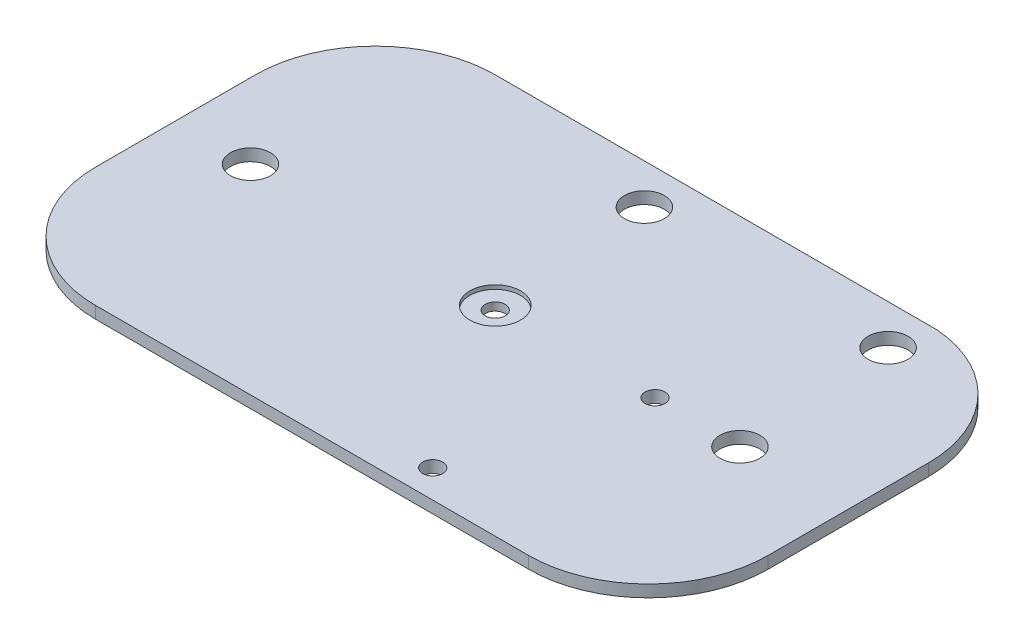
ISO-10303-21;
HEADER;
FILE_DESCRIPTION(('STEP AP214'),'2;1');
FILE_NAME('part.step','',(''),(''),'','','');
FILE_SCHEMA(('AUTOMOTIVE_DESIGN { 1 0 10303 214 1 1 1 1 }'));
ENDSEC;
DATA;
#1=APPLICATION_CONTEXT('core data for automotive mechanical design processes');
#2=APPLICATION_PROTOCOL_DEFINITION('international standard','automotive_design',2000,#1);
#3=PRODUCT_CONTEXT('',#1,'mechanical');
#4=PRODUCT('Part','Part','',(#3));
#5=PRODUCT_RELATED_PRODUCT_CATEGORY('part','',(#4));
#6=PRODUCT_DEFINITION_FORMATION('','',#4);
#7=PRODUCT_DEFINITION_CONTEXT('part definition',#1,'design');
#8=PRODUCT_DEFINITION('design','',#6,#7);
#9=PRODUCT_DEFINITION_SHAPE('','',#8);
#10=(LENGTH_UNIT() NAMED_UNIT(*) SI_UNIT(.MILLI.,.METRE.));
#11=(NAMED_UNIT(*) PLANE_ANGLE_UNIT() SI_UNIT($,.RADIAN.));
#12=(NAMED_UNIT(*) SI_UNIT($,.STERADIAN.) SOLID_ANGLE_UNIT());
#13=UNCERTAINTY_MEASURE_WITH_UNIT(LENGTH_MEASURE(1.E-05),#10,'distance_accuracy_value','');
#14=(GEOMETRIC_REPRESENTATION_CONTEXT(3) GLOBAL_UNCERTAINTY_ASSIGNED_CONTEXT((#13)) GLOBAL_UNIT_ASSIGNED_CONTEXT((#10,
#11,#12)) REPRESENTATION_CONTEXT('',''));
#15=CARTESIAN_POINT('',(0.,0.,0.));
#16=DIRECTION('',(0.,0.,1.));
#17=DIRECTION('',(1.,0.,0.));
#18=AXIS2_PLACEMENT_3D('',#15,#16,#17);
#19=CARTESIAN_POINT('',(30.,-50.,50.));
#20=DIRECTION('',(0.,1.,0.));
#21=DIRECTION('',(0.,0.,1.));
#22=AXIS2_PLACEMENT_3D('',#19,#20,#21);
#23=CYLINDRICAL_SURFACE('',#22,2.5);
#24=CARTESIAN_POINT('',(30.,0.,50.));
#25=DIRECTION('',(0.,-1.,0.));
#26=DIRECTION('',(0.,0.,-1.));
#27=AXIS2_PLACEMENT_3D('',#24,#25,#26);
#28=CIRCLE('',#27,2.5);
#29=CARTESIAN_POINT('',(30.,0.,52.5));
#30=VERTEX_POINT('',#29);
#31=EDGE_CURVE('E152',#30,#30,#28,.T.);
#32=CARTESIAN_POINT('',(30.,1.99999999999999,50.));
#33=DIRECTION('',(0.,1.,0.));
#34=DIRECTION('',(-1.,0.,0.));
#35=AXIS2_PLACEMENT_3D('',#32,#33,#34);
#36=CIRCLE('',#35,2.5);
#37=CARTESIAN_POINT('',(30.,1.99999999999999,52.5));
#38=VERTEX_POINT('',#37);
#39=EDGE_CURVE('E153',#38,#38,#36,.F.);
#40=CARTESIAN_POINT('',(30.,0.,52.5));
#41=CARTESIAN_POINT('',(30.,0.0208333333333333,52.5));
#42=CARTESIAN_POINT('',(30.,0.0416666666666667,52.5));
#43=CARTESIAN_POINT('',(30.,0.0833333333333334,52.5));
#44=CARTESIAN_POINT('',(30.,0.104166666666667,52.5));
#45=CARTESIAN_POINT('',(30.,0.145833333333333,52.5));
#46=CARTESIAN_POINT('',(30.,0.166666666666667,52.5));
#47=CARTESIAN_POINT('',(30.,0.208333333333334,52.5));
#48=CARTESIAN_POINT('',(30.,0.229166666666667,52.5));
#49=CARTESIAN_POINT('',(30.,0.270833333333334,52.5));
#50=CARTESIAN_POINT('',(30.,0.291666666666667,52.5));
#51=CARTESIAN_POINT('',(30.,0.333333333333334,52.5));
#52=CARTESIAN_POINT('',(30.,0.354166666666667,52.5));
#53=CARTESIAN_POINT('',(30.,0.395833333333334,52.5));
#54=CARTESIAN_POINT('',(30.,0.416666666666667,52.5));
#55=CARTESIAN_POINT('',(30.,0.458333333333334,52.5));
#56=CARTESIAN_POINT('',(30.,0.479166666666667,52.5));
#57=CARTESIAN_POINT('',(30.,0.520833333333331,52.5));
#58=CARTESIAN_POINT('',(30.,0.541666666666663,52.5));
#59=CARTESIAN_POINT('',(30.,0.583333333333327,52.5));
#60=CARTESIAN_POINT('',(30.,0.60416666666666,52.5));
#61=CARTESIAN_POINT('',(30.,0.645833333333327,52.5));
#62=CARTESIAN_POINT('',(30.,0.66666666666666,52.5));
#63=CARTESIAN_POINT('',(30.,0.708333333333327,52.5));
#64=CARTESIAN_POINT('',(30.,0.72916666666666,52.5));
#65=CARTESIAN_POINT('',(30.,0.770833333333327,52.5));
#66=CARTESIAN_POINT('',(30.,0.79166666666666,52.5));
#67=CARTESIAN_POINT('',(30.,0.833333333333327,52.5));
#68=CARTESIAN_POINT('',(30.,0.854166666666661,52.5));
#69=CARTESIAN_POINT('',(30.,0.895833333333327,52.5));
#70=CARTESIAN_POINT('',(30.,0.916666666666661,52.5));
#71=CARTESIAN_POINT('',(30.,0.958333333333327,52.5));
#72=CARTESIAN_POINT('',(30.,0.979166666666661,52.5));
#73=CARTESIAN_POINT('',(30.,1.02083333333333,52.5));
#74=CARTESIAN_POINT('',(30.,1.04166666666666,52.5));
#75=CARTESIAN_POINT('',(30.,1.08333333333333,52.5));
#76=CARTESIAN_POINT('',(30.,1.10416666666666,52.5));
#77=CARTESIAN_POINT('',(30.,1.14583333333333,52.5));
#78=CARTESIAN_POINT('',(30.,1.16666666666666,52.5));
#79=CARTESIAN_POINT('',(30.,1.20833333333333,52.5));
#80=CARTESIAN_POINT('',(30.,1.22916666666666,52.5));
#81=CARTESIAN_POINT('',(30.,1.27083333333333,52.5));
#82=CARTESIAN_POINT('',(30.,1.29166666666666,52.5));
#83=CARTESIAN_POINT('',(30.,1.33333333333333,52.5));
#84=CARTESIAN_POINT('',(30.,1.35416666666666,52.5));
#85=CARTESIAN_POINT('',(30.,1.39583333333333,52.5));
#86=CARTESIAN_POINT('',(30.,1.41666666666666,52.5));
#87=CARTESIAN_POINT('',(30.,1.45833333333333,52.5));
#88=CARTESIAN_POINT('',(30.,1.47916666666666,52.5));
#89=CARTESIAN_POINT('',(30.,1.52083333333332,52.5));
#90=CARTESIAN_POINT('',(30.,1.54166666666665,52.5));
#91=CARTESIAN_POINT('',(30.,1.58333333333332,52.5));
#92=CARTESIAN_POINT('',(30.,1.60416666666665,52.5));
#93=CARTESIAN_POINT('',(30.,1.64583333333332,52.5));
#94=CARTESIAN_POINT('',(30.,1.66666666666665,52.5));
#95=CARTESIAN_POINT('',(30.,1.70833333333332,52.5));
#96=CARTESIAN_POINT('',(30.,1.72916666666665,52.5));
#97=CARTESIAN_POINT('',(30.,1.77083333333332,52.5));
#98=CARTESIAN_POINT('',(30.,1.79166666666665,52.5));
#99=CARTESIAN_POINT('',(30.,1.83333333333332,52.5));
#100=CARTESIAN_POINT('',(30.,1.85416666666665,52.5));
#101=CARTESIAN_POINT('',(30.,1.89583333333332,52.5));
#102=CARTESIAN_POINT('',(30.,1.91666666666665,52.5));
#103=CARTESIAN_POINT('',(30.,1.95833333333332,52.5));
#104=CARTESIAN_POINT('',(30.,1.97916666666665,52.5));
#105=CARTESIAN_POINT('',(30.,1.99999999999999,52.5));
#106=B_SPLINE_CURVE_WITH_KNOTS('',3,(#40,#41,#42,#43,#44,#45,#46,#47,#48,#49,#50,#51,#52,#53,
#54,#55,#56,#57,#58,#59,#60,#61,#62,#63,#64,#65,#66,#67,#68,#69,#70,#71,#72,#73,#74,#75,#76,#77,
#78,#79,#80,#81,#82,#83,#84,#85,#86,#87,#88,#89,#90,#91,#92,#93,#94,#95,#96,#97,#98,#99,#100,
#101,#102,#103,#104,#105),.UNSPECIFIED.,.F.,.F.,(4,2,2,2,2,2,2,2,2,2,2,2,2,2,2,2,2,2,2,2,2,2,2,
2,2,2,2,2,2,2,2,2,4),(0.,0.0625000000000001,0.125,0.1875,0.25,0.3125,0.375,0.4375,0.5,
0.562499999999994,0.624999999999994,0.687499999999994,0.749999999999994,0.812499999999994,
0.874999999999994,0.937499999999994,0.999999999999994,1.06249999999999,1.12499999999999,
1.18749999999999,1.24999999999999,1.31249999999999,1.37499999999999,1.43749999999999,
1.49999999999999,1.56249999999999,1.62499999999999,1.68749999999999,1.74999999999999,
1.81249999999999,1.87499999999999,1.93749999999999,1.99999999999999),.UNSPECIFIED.);
#107=EDGE_CURVE('BSEAM42',#30,#38,#106,.T.);
#108=ORIENTED_EDGE('',*,*,#31,.T.);
#109=ORIENTED_EDGE('',*,*,#39,.F.);
#110=ORIENTED_EDGE('',*,*,#107,.T.);
#111=ORIENTED_EDGE('',*,*,#107,.F.);
#112=EDGE_LOOP('',(#108,#110,#109,#111));
#113=FACE_BOUND('',#112,.T.);
#114=ADVANCED_FACE('F42',(#113),#23,.F.);
#115=CARTESIAN_POINT('',(-50.,40.,0.));
#116=DIRECTION('',(0.,0.,-1.));
#117=DIRECTION('',(-1.,0.,0.));
#118=AXIS2_PLACEMENT_3D('',#115,#116,#117);
#119=PLANE('',#118);
#120=DIRECTION('',(1.,0.,0.));
#121=VECTOR('',#120,1.);
#122=CARTESIAN_POINT('',(-50.,0.,0.));
#123=LINE('',#122,#121);
#124=CARTESIAN_POINT('',(-20.,0.,0.));
#125=VERTEX_POINT('',#124);
#126=CARTESIAN_POINT('',(90.5,0.,0.));
#127=VERTEX_POINT('',#126);
#128=EDGE_CURVE('E114',#125,#127,#123,.T.);
#129=ORIENTED_EDGE('',*,*,#128,.F.);
#130=DIRECTION('',(0.,-1.,0.));
#131=VECTOR('',#130,1.);
#132=CARTESIAN_POINT('',(-20.,40.,0.));
#133=LINE('',#132,#131);
#134=CARTESIAN_POINT('',(-20.,2.99999999999998,0.));
#135=VERTEX_POINT('',#134);
#136=EDGE_CURVE('E11',#125,#135,#133,.F.);
#137=ORIENTED_EDGE('',*,*,#136,.T.);
#138=DIRECTION('',(1.,0.,0.));
#139=VECTOR('',#138,1.);
#140=CARTESIAN_POINT('',(150.,3.,0.));
#141=LINE('',#140,#139);
#142=CARTESIAN_POINT('',(90.5,2.99999999999999,0.));
#143=VERTEX_POINT('',#142);
#144=EDGE_CURVE('E116',#135,#143,#141,.T.);
#145=ORIENTED_EDGE('',*,*,#144,.T.);
#146=DIRECTION('',(0.,1.,0.));
#147=VECTOR('',#146,1.);
#148=CARTESIAN_POINT('',(90.5,-50.,0.));
#149=LINE('',#148,#147);
#150=EDGE_CURVE('E110',#127,#143,#149,.T.);
#151=ORIENTED_EDGE('',*,*,#150,.F.);
#152=EDGE_LOOP('',(#129,#137,#145,#151));
#153=FACE_BOUND('',#152,.T.);
#154=ADVANCED_FACE('F112',(#153),#119,.T.);
#155=CARTESIAN_POINT('',(150.,40.,100.));
#156=DIRECTION('',(0.,0.,1.));
#157=DIRECTION('',(1.,0.,0.));
#158=AXIS2_PLACEMENT_3D('',#155,#156,#157);
#159=PLANE('',#158);
#160=DIRECTION('',(-1.,0.,0.));
#161=VECTOR('',#160,1.);
#162=CARTESIAN_POINT('',(150.,0.,100.));
#163=LINE('',#162,#161);
#164=CARTESIAN_POINT('',(88.3346252635513,0.,100.));
#165=VERTEX_POINT('',#164);
#166=CARTESIAN_POINT('',(-20.,0.,100.));
#167=VERTEX_POINT('',#166);
#168=EDGE_CURVE('E144',#165,#167,#163,.T.);
#169=ORIENTED_EDGE('',*,*,#168,.F.);
#170=DIRECTION('',(0.,-1.,0.));
#171=VECTOR('',#170,1.);
#172=CARTESIAN_POINT('',(88.3346252635513,40.,100.));
#173=LINE('',#172,#171);
#174=CARTESIAN_POINT('',(88.3346252635513,2.99999999999999,100.));
#175=VERTEX_POINT('',#174);
#176=EDGE_CURVE('E58',#165,#175,#173,.F.);
#177=ORIENTED_EDGE('',*,*,#176,.T.);
#178=DIRECTION('',(1.,0.,0.));
#179=VECTOR('',#178,1.);
#180=CARTESIAN_POINT('',(150.,3.,100.));
#181=LINE('',#180,#179);
#182=CARTESIAN_POINT('',(-20.,2.99999999999998,100.));
#183=VERTEX_POINT('',#182);
#184=EDGE_CURVE('E189',#183,#175,#181,.T.);
#185=ORIENTED_EDGE('',*,*,#184,.F.);
#186=DIRECTION('',(0.,-1.,0.));
#187=VECTOR('',#186,1.);
#188=CARTESIAN_POINT('',(-20.,40.,100.));
#189=LINE('',#188,#187);
#190=EDGE_CURVE('E170',#183,#167,#189,.T.);
#191=ORIENTED_EDGE('',*,*,#190,.T.);
#192=EDGE_LOOP('',(#169,#177,#185,#191));
#193=FACE_BOUND('',#192,.T.);
#194=ADVANCED_FACE('F251',(#193),#159,.T.);
#195=CARTESIAN_POINT('',(30.,1.99999999999999,50.));
#196=DIRECTION('',(0.,1.,0.));
#197=DIRECTION('',(-1.,0.,0.));
#198=AXIS2_PLACEMENT_3D('',#195,#196,#197);
#199=PLANE('',#198);
#200=CARTESIAN_POINT('',(30.,1.99999999999999,50.));
#201=DIRECTION('',(0.,1.,0.));
#202=DIRECTION('',(-1.,0.,0.));
#203=AXIS2_PLACEMENT_3D('',#200,#201,#202);
#204=CIRCLE('',#203,6.35);
#205=CARTESIAN_POINT('',(23.65,1.99999999999999,50.));
#206=VERTEX_POINT('',#205);
#207=EDGE_CURVE('E155',#206,#206,#204,.T.);
#208=ORIENTED_EDGE('',*,*,#207,.T.);
#209=EDGE_LOOP('',(#208));
#210=FACE_BOUND('',#209,.T.);
#211=ORIENTED_EDGE('',*,*,#39,.T.);
#212=EDGE_LOOP('',(#211));
#213=FACE_BOUND('',#212,.T.);
#214=ADVANCED_FACE('F262',(#210,#213),#199,.T.);
#215=CARTESIAN_POINT('',(0.,0.,0.));
#216=DIRECTION('',(0.,-1.,0.));
#217=DIRECTION('',(0.,0.,-1.));
#218=AXIS2_PLACEMENT_3D('',#215,#216,#217);
#219=PLANE('',#218);
#220=CARTESIAN_POINT('',(57.3565923518305,0.,92.9999999999893));
#221=DIRECTION('',(0.,-1.,0.));
#222=DIRECTION('',(0.,0.,-1.));
#223=AXIS2_PLACEMENT_3D('',#220,#221,#222);
#224=CIRCLE('',#223,2.5);
#225=CARTESIAN_POINT('',(57.3565923518305,0.,90.4999999999893));
#226=VERTEX_POINT('',#225);
#227=EDGE_CURVE('E227',#226,#226,#224,.T.);
#228=ORIENTED_EDGE('',*,*,#227,.F.);
#229=EDGE_LOOP('',(#228));
#230=FACE_BOUND('',#229,.T.);
#231=DIRECTION('',(0.,0.,1.));
#232=VECTOR('',#231,1.);
#233=CARTESIAN_POINT('',(118.334625263551,0.,0.));
#234=LINE('',#233,#232);
#235=CARTESIAN_POINT('',(118.334625263551,0.,29.921750487743));
#236=VERTEX_POINT('',#235);
#237=CARTESIAN_POINT('',(118.334625263551,0.,70.));
#238=VERTEX_POINT('',#237);
#239=EDGE_CURVE('E206',#236,#238,#234,.T.);
#240=ORIENTED_EDGE('',*,*,#239,.T.);
#241=CARTESIAN_POINT('',(88.3346252635513,0.,70.));
#242=DIRECTION('',(0.,-1.,0.));
#243=DIRECTION('',(0.,0.,-1.));
#244=AXIS2_PLACEMENT_3D('',#241,#242,#243);
#245=CIRCLE('',#244,30.);
#246=EDGE_CURVE('E128',#238,#165,#245,.T.);
#247=ORIENTED_EDGE('',*,*,#246,.T.);
#248=ORIENTED_EDGE('',*,*,#168,.T.);
#249=CARTESIAN_POINT('',(-20.,0.,70.));
#250=DIRECTION('',(0.,-1.,0.));
#251=DIRECTION('',(0.,0.,-1.));
#252=AXIS2_PLACEMENT_3D('',#249,#250,#251);
#253=CIRCLE('',#252,30.);
#254=CARTESIAN_POINT('',(-50.,0.,70.));
#255=VERTEX_POINT('',#254);
#256=EDGE_CURVE('E138',#167,#255,#253,.T.);
#257=ORIENTED_EDGE('',*,*,#256,.T.);
#258=DIRECTION('',(0.,0.,-1.));
#259=VECTOR('',#258,1.);
#260=CARTESIAN_POINT('',(-50.,0.,100.));
#261=LINE('',#260,#259);
#262=CARTESIAN_POINT('',(-50.,0.,30.));
#263=VERTEX_POINT('',#262);
#264=EDGE_CURVE('E119',#255,#263,#261,.T.);
#265=ORIENTED_EDGE('',*,*,#264,.T.);
#266=CARTESIAN_POINT('',(-20.,0.,30.));
#267=DIRECTION('',(0.,-1.,0.));
#268=DIRECTION('',(0.,0.,-1.));
#269=AXIS2_PLACEMENT_3D('',#266,#267,#268);
#270=CIRCLE('',#269,30.);
#271=EDGE_CURVE('E133',#263,#125,#270,.T.);
#272=ORIENTED_EDGE('',*,*,#271,.T.);
#273=ORIENTED_EDGE('',*,*,#128,.T.);
#274=CARTESIAN_POINT('',(88.3346252635513,0.,29.921750487743));
#275=DIRECTION('',(0.,-1.,0.));
#276=DIRECTION('',(0.,0.,-1.));
#277=AXIS2_PLACEMENT_3D('',#274,#275,#276);
#278=CIRCLE('',#277,30.);
#279=EDGE_CURVE('E122',#127,#236,#278,.T.);
#280=ORIENTED_EDGE('',*,*,#279,.T.);
#281=EDGE_LOOP('',(#240,#247,#248,#257,#265,#272,#273,#280));
#282=FACE_BOUND('',#281,.T.);
#283=CARTESIAN_POINT('',(27.3346252635511,0.,10.));
#284=DIRECTION('',(0.,-1.,0.));
#285=DIRECTION('',(0.,0.,-1.));
#286=AXIS2_PLACEMENT_3D('',#283,#284,#285);
#287=CIRCLE('',#286,5.);
#288=CARTESIAN_POINT('',(27.3346252635511,0.,5.));
#289=VERTEX_POINT('',#288);
#290=EDGE_CURVE('E216',#289,#289,#287,.T.);
#291=ORIENTED_EDGE('',*,*,#290,.F.);
#292=EDGE_LOOP('',(#291));
#293=FACE_BOUND('',#292,.T.);
#294=CARTESIAN_POINT('',(88.3346252635511,0.,10.));
#295=DIRECTION('',(0.,-1.,0.));
#296=DIRECTION('',(0.,0.,-1.));
#297=AXIS2_PLACEMENT_3D('',#294,#295,#296);
#298=CIRCLE('',#297,5.);
#299=CARTESIAN_POINT('',(88.3346252635511,0.,5.));
#300=VERTEX_POINT('',#299);
#301=EDGE_CURVE('E222',#300,#300,#298,.T.);
#302=ORIENTED_EDGE('',*,*,#301,.F.);
#303=EDGE_LOOP('',(#302));
#304=FACE_BOUND('',#303,.T.);
#305=ORIENTED_EDGE('',*,*,#31,.F.);
#306=EDGE_LOOP('',(#305));
#307=FACE_BOUND('',#306,.T.);
#308=CARTESIAN_POINT('',(70.,0.,50.));
#309=DIRECTION('',(0.,-1.,0.));
#310=DIRECTION('',(0.,0.,-1.));
#311=AXIS2_PLACEMENT_3D('',#308,#309,#310);
#312=CIRCLE('',#311,2.5);
#313=CARTESIAN_POINT('',(70.,0.,52.5));
#314=VERTEX_POINT('',#313);
#315=EDGE_CURVE('E151',#314,#314,#312,.T.);
#316=ORIENTED_EDGE('',*,*,#315,.F.);
#317=EDGE_LOOP('',(#316));
#318=FACE_BOUND('',#317,.T.);
#319=CARTESIAN_POINT('',(91.25,0.,50.));
#320=DIRECTION('',(0.,-1.,0.));
#321=DIRECTION('',(0.,0.,-1.));
#322=AXIS2_PLACEMENT_3D('',#319,#320,#321);
#323=CIRCLE('',#322,5.00000000000001);
#324=CARTESIAN_POINT('',(91.25,0.,45.));
#325=VERTEX_POINT('',#324);
#326=EDGE_CURVE('E205',#325,#325,#323,.T.);
#327=ORIENTED_EDGE('',*,*,#326,.F.);
#328=EDGE_LOOP('',(#327));
#329=FACE_BOUND('',#328,.T.);
#330=CARTESIAN_POINT('',(-31.25,0.,50.));
#331=DIRECTION('',(0.,-1.,0.));
#332=DIRECTION('',(0.,0.,-1.));
#333=AXIS2_PLACEMENT_3D('',#330,#331,#332);
#334=CIRCLE('',#333,5.);
#335=CARTESIAN_POINT('',(-31.25,0.,45.));
#336=VERTEX_POINT('',#335);
#337=EDGE_CURVE('E209',#336,#336,#334,.T.);
#338=ORIENTED_EDGE('',*,*,#337,.F.);
#339=EDGE_LOOP('',(#338));
#340=FACE_BOUND('',#339,.T.);
#341=ADVANCED_FACE('F130',(#230,#282,#293,#304,#307,#318,#329,#340),#219,.T.);
#342=CARTESIAN_POINT('',(-20.,40.,70.));
#343=DIRECTION('',(0.,-1.,0.));
#344=DIRECTION('',(0.,0.,-1.));
#345=AXIS2_PLACEMENT_3D('',#342,#343,#344);
#346=CYLINDRICAL_SURFACE('',#345,30.);
#347=CARTESIAN_POINT('',(-20.,2.99999999999998,70.));
#348=DIRECTION('',(0.,-1.,0.));
#349=DIRECTION('',(1.,0.,0.));
#350=AXIS2_PLACEMENT_3D('',#347,#348,#349);
#351=CIRCLE('',#350,30.);
#352=CARTESIAN_POINT('',(-50.,2.99999999999998,70.));
#353=VERTEX_POINT('',#352);
#354=EDGE_CURVE('E65',#353,#183,#351,.F.);
#355=ORIENTED_EDGE('',*,*,#354,.F.);
#356=DIRECTION('',(0.,-1.,0.));
#357=VECTOR('',#356,1.);
#358=CARTESIAN_POINT('',(-50.,40.,70.));
#359=LINE('',#358,#357);
#360=EDGE_CURVE('E174',#255,#353,#359,.F.);
#361=ORIENTED_EDGE('',*,*,#360,.F.);
#362=ORIENTED_EDGE('',*,*,#256,.F.);
#363=ORIENTED_EDGE('',*,*,#190,.F.);
#364=EDGE_LOOP('',(#355,#361,#362,#363));
#365=FACE_BOUND('',#364,.T.);
#366=ADVANCED_FACE('F44',(#365),#346,.T.);
#367=CARTESIAN_POINT('',(-50.,40.,100.));
#368=DIRECTION('',(-1.,0.,0.));
#369=DIRECTION('',(0.,0.,1.));
#370=AXIS2_PLACEMENT_3D('',#367,#368,#369);
#371=PLANE('',#370);
#372=DIRECTION('',(0.,0.,1.));
#373=VECTOR('',#372,1.);
#374=CARTESIAN_POINT('',(-50.,2.99999999999998,0.));
#375=LINE('',#374,#373);
#376=CARTESIAN_POINT('',(-50.,2.99999999999998,30.));
#377=VERTEX_POINT('',#376);
#378=EDGE_CURVE('E142',#377,#353,#375,.T.);
#379=ORIENTED_EDGE('',*,*,#378,.F.);
#380=DIRECTION('',(0.,-1.,0.));
#381=VECTOR('',#380,1.);
#382=CARTESIAN_POINT('',(-50.,40.,30.));
#383=LINE('',#382,#381);
#384=EDGE_CURVE('E51',#377,#263,#383,.T.);
#385=ORIENTED_EDGE('',*,*,#384,.T.);
#386=ORIENTED_EDGE('',*,*,#264,.F.);
#387=ORIENTED_EDGE('',*,*,#360,.T.);
#388=EDGE_LOOP('',(#379,#385,#386,#387));
#389=FACE_BOUND('',#388,.T.);
#390=ADVANCED_FACE('F181',(#389),#371,.T.);
#391=CARTESIAN_POINT('',(-20.,40.,30.));
#392=DIRECTION('',(0.,-1.,0.));
#393=DIRECTION('',(0.,0.,-1.));
#394=AXIS2_PLACEMENT_3D('',#391,#392,#393);
#395=CYLINDRICAL_SURFACE('',#394,30.);
#396=CARTESIAN_POINT('',(-20.,2.99999999999998,30.));
#397=DIRECTION('',(0.,-1.,0.));
#398=DIRECTION('',(1.,0.,0.));
#399=AXIS2_PLACEMENT_3D('',#396,#397,#398);
#400=CIRCLE('',#399,30.);
#401=EDGE_CURVE('E164',#135,#377,#400,.F.);
#402=ORIENTED_EDGE('',*,*,#401,.F.);
#403=ORIENTED_EDGE('',*,*,#136,.F.);
#404=ORIENTED_EDGE('',*,*,#271,.F.);
#405=ORIENTED_EDGE('',*,*,#384,.F.);
#406=EDGE_LOOP('',(#402,#403,#404,#405));
#407=FACE_BOUND('',#406,.T.);
#408=ADVANCED_FACE('F185',(#407),#395,.T.);
#409=CARTESIAN_POINT('',(150.,3.,0.));
#410=DIRECTION('',(0.,-1.,0.));
#411=DIRECTION('',(1.,0.,0.));
#412=AXIS2_PLACEMENT_3D('',#409,#410,#411);
#413=PLANE('',#412);
#414=CARTESIAN_POINT('',(57.3565923518305,2.99999999999999,92.9999999999893));
#415=DIRECTION('',(0.,-1.,0.));
#416=DIRECTION('',(1.,0.,0.));
#417=AXIS2_PLACEMENT_3D('',#414,#415,#416);
#418=CIRCLE('',#417,2.5);
#419=CARTESIAN_POINT('',(59.8565923518305,2.99999999999999,92.9999999999893));
#420=VERTEX_POINT('',#419);
#421=EDGE_CURVE('E46',#420,#420,#418,.T.);
#422=ORIENTED_EDGE('',*,*,#421,.T.);
#423=EDGE_LOOP('',(#422));
#424=FACE_BOUND('',#423,.T.);
#425=ORIENTED_EDGE('',*,*,#401,.T.);
#426=ORIENTED_EDGE('',*,*,#378,.T.);
#427=ORIENTED_EDGE('',*,*,#354,.T.);
#428=ORIENTED_EDGE('',*,*,#184,.T.);
#429=CARTESIAN_POINT('',(88.3346252635513,2.99999999999999,70.));
#430=DIRECTION('',(0.,-1.,0.));
#431=DIRECTION('',(1.,0.,0.));
#432=AXIS2_PLACEMENT_3D('',#429,#430,#431);
#433=CIRCLE('',#432,30.);
#434=CARTESIAN_POINT('',(118.334625263551,3.,70.));
#435=VERTEX_POINT('',#434);
#436=EDGE_CURVE('E166',#175,#435,#433,.F.);
#437=ORIENTED_EDGE('',*,*,#436,.T.);
#438=DIRECTION('',(0.,0.,1.));
#439=VECTOR('',#438,1.);
#440=CARTESIAN_POINT('',(118.334625263551,3.,0.));
#441=LINE('',#440,#439);
#442=CARTESIAN_POINT('',(118.334625263551,3.,29.921750487743));
#443=VERTEX_POINT('',#442);
#444=EDGE_CURVE('E135',#443,#435,#441,.T.);
#445=ORIENTED_EDGE('',*,*,#444,.F.);
#446=CARTESIAN_POINT('',(88.3346252635513,3.,29.921750487743));
#447=DIRECTION('',(0.,-1.,0.));
#448=DIRECTION('',(1.,0.,0.));
#449=AXIS2_PLACEMENT_3D('',#446,#447,#448);
#450=CIRCLE('',#449,30.);
#451=EDGE_CURVE('E168',#443,#143,#450,.F.);
#452=ORIENTED_EDGE('',*,*,#451,.T.);
#453=ORIENTED_EDGE('',*,*,#144,.F.);
#454=EDGE_LOOP('',(#425,#426,#427,#428,#437,#445,#452,#453));
#455=FACE_BOUND('',#454,.T.);
#456=CARTESIAN_POINT('',(70.,2.99999999999999,50.));
#457=DIRECTION('',(0.,-1.,0.));
#458=DIRECTION('',(1.,0.,0.));
#459=AXIS2_PLACEMENT_3D('',#456,#457,#458);
#460=CIRCLE('',#459,2.5);
#461=CARTESIAN_POINT('',(70.,2.99999999999999,52.5));
#462=VERTEX_POINT('',#461);
#463=EDGE_CURVE('E148',#462,#462,#460,.T.);
#464=ORIENTED_EDGE('',*,*,#463,.T.);
#465=EDGE_LOOP('',(#464));
#466=FACE_BOUND('',#465,.T.);
#467=CARTESIAN_POINT('',(30.,2.99999999999999,50.));
#468=DIRECTION('',(0.,1.,0.));
#469=DIRECTION('',(-1.,0.,0.));
#470=AXIS2_PLACEMENT_3D('',#467,#468,#469);
#471=CIRCLE('',#470,6.35);
#472=CARTESIAN_POINT('',(23.65,2.99999999999999,50.));
#473=VERTEX_POINT('',#472);
#474=EDGE_CURVE('E196',#473,#473,#471,.T.);
#475=ORIENTED_EDGE('',*,*,#474,.F.);
#476=EDGE_LOOP('',(#475));
#477=FACE_BOUND('',#476,.T.);
#478=CARTESIAN_POINT('',(91.25,3.,50.));
#479=DIRECTION('',(0.,-1.,0.));
#480=DIRECTION('',(0.,0.,-1.));
#481=AXIS2_PLACEMENT_3D('',#478,#479,#480);
#482=CIRCLE('',#481,5.00000000000001);
#483=CARTESIAN_POINT('',(91.25,3.,45.));
#484=VERTEX_POINT('',#483);
#485=EDGE_CURVE('E202',#484,#484,#482,.T.);
#486=ORIENTED_EDGE('',*,*,#485,.T.);
#487=EDGE_LOOP('',(#486));
#488=FACE_BOUND('',#487,.T.);
#489=CARTESIAN_POINT('',(-31.25,3.,50.));
#490=DIRECTION('',(0.,-1.,0.));
#491=DIRECTION('',(0.,0.,-1.));
#492=AXIS2_PLACEMENT_3D('',#489,#490,#491);
#493=CIRCLE('',#492,5.);
#494=CARTESIAN_POINT('',(-31.25,3.,45.));
#495=VERTEX_POINT('',#494);
#496=EDGE_CURVE('E199',#495,#495,#493,.T.);
#497=ORIENTED_EDGE('',*,*,#496,.T.);
#498=EDGE_LOOP('',(#497));
#499=FACE_BOUND('',#498,.T.);
#500=CARTESIAN_POINT('',(27.3346252635511,3.,10.));
#501=DIRECTION('',(0.,-1.,0.));
#502=DIRECTION('',(0.,0.,-1.));
#503=AXIS2_PLACEMENT_3D('',#500,#501,#502);
#504=CIRCLE('',#503,5.);
#505=CARTESIAN_POINT('',(27.3346252635511,3.,5.));
#506=VERTEX_POINT('',#505);
#507=EDGE_CURVE('E215',#506,#506,#504,.T.);
#508=ORIENTED_EDGE('',*,*,#507,.T.);
#509=EDGE_LOOP('',(#508));
#510=FACE_BOUND('',#509,.T.);
#511=CARTESIAN_POINT('',(88.3346252635511,3.,10.));
#512=DIRECTION('',(0.,-1.,0.));
#513=DIRECTION('',(0.,0.,-1.));
#514=AXIS2_PLACEMENT_3D('',#511,#512,#513);
#515=CIRCLE('',#514,5.);
#516=CARTESIAN_POINT('',(88.3346252635511,3.,5.));
#517=VERTEX_POINT('',#516);
#518=EDGE_CURVE('E219',#517,#517,#515,.T.);
#519=ORIENTED_EDGE('',*,*,#518,.T.);
#520=EDGE_LOOP('',(#519));
#521=FACE_BOUND('',#520,.T.);
#522=ADVANCED_FACE('F186',(#424,#455,#466,#477,#488,#499,#510,#521),#413,.F.);
#523=CARTESIAN_POINT('',(88.3346252635513,40.,29.921750487743));
#524=DIRECTION('',(0.,1.,0.));
#525=DIRECTION('',(0.,0.,1.));
#526=AXIS2_PLACEMENT_3D('',#523,#524,#525);
#527=CYLINDRICAL_SURFACE('',#526,30.);
#528=ORIENTED_EDGE('',*,*,#451,.F.);
#529=DIRECTION('',(0.,-1.,0.));
#530=VECTOR('',#529,1.);
#531=CARTESIAN_POINT('',(118.334625263551,3.,29.921750487743));
#532=LINE('',#531,#530);
#533=EDGE_CURVE('E124',#236,#443,#532,.F.);
#534=ORIENTED_EDGE('',*,*,#533,.F.);
#535=ORIENTED_EDGE('',*,*,#279,.F.);
#536=ORIENTED_EDGE('',*,*,#150,.T.);
#537=EDGE_LOOP('',(#528,#534,#535,#536));
#538=FACE_BOUND('',#537,.T.);
#539=ADVANCED_FACE('F123',(#538),#527,.T.);
#540=CARTESIAN_POINT('',(118.334625263551,83.4152076037248,100.));
#541=DIRECTION('',(1.,0.,0.));
#542=DIRECTION('',(0.,1.,0.));
#543=AXIS2_PLACEMENT_3D('',#540,#541,#542);
#544=PLANE('',#543);
#545=ORIENTED_EDGE('',*,*,#239,.F.);
#546=ORIENTED_EDGE('',*,*,#533,.T.);
#547=ORIENTED_EDGE('',*,*,#444,.T.);
#548=DIRECTION('',(0.,-1.,0.));
#549=VECTOR('',#548,1.);
#550=CARTESIAN_POINT('',(118.334625263551,83.4152076037248,70.));
#551=LINE('',#550,#549);
#552=EDGE_CURVE('E127',#435,#238,#551,.T.);
#553=ORIENTED_EDGE('',*,*,#552,.T.);
#554=EDGE_LOOP('',(#545,#546,#547,#553));
#555=FACE_BOUND('',#554,.T.);
#556=ADVANCED_FACE('F270',(#555),#544,.T.);
#557=CARTESIAN_POINT('',(88.3346252635513,83.4152076037248,70.));
#558=DIRECTION('',(0.,-1.,0.));
#559=DIRECTION('',(1.,0.,0.));
#560=AXIS2_PLACEMENT_3D('',#557,#558,#559);
#561=CYLINDRICAL_SURFACE('',#560,30.);
#562=ORIENTED_EDGE('',*,*,#436,.F.);
#563=ORIENTED_EDGE('',*,*,#176,.F.);
#564=ORIENTED_EDGE('',*,*,#246,.F.);
#565=ORIENTED_EDGE('',*,*,#552,.F.);
#566=EDGE_LOOP('',(#562,#563,#564,#565));
#567=FACE_BOUND('',#566,.T.);
#568=ADVANCED_FACE('F271',(#567),#561,.T.);
#569=CARTESIAN_POINT('',(-31.25,3.,50.));
#570=DIRECTION('',(0.,-1.,0.));
#571=DIRECTION('',(0.,0.,-1.));
#572=AXIS2_PLACEMENT_3D('',#569,#570,#571);
#573=CYLINDRICAL_SURFACE('',#572,5.);
#574=ORIENTED_EDGE('',*,*,#496,.F.);
#575=EDGE_LOOP('',(#574));
#576=FACE_BOUND('',#575,.T.);
#577=ORIENTED_EDGE('',*,*,#337,.T.);
#578=EDGE_LOOP('',(#577));
#579=FACE_BOUND('',#578,.T.);
#580=ADVANCED_FACE('F273',(#576,#579),#573,.F.);
#581=CARTESIAN_POINT('',(91.25,3.,50.));
#582=DIRECTION('',(0.,-1.,0.));
#583=DIRECTION('',(0.,0.,-1.));
#584=AXIS2_PLACEMENT_3D('',#581,#582,#583);
#585=CYLINDRICAL_SURFACE('',#584,5.00000000000001);
#586=ORIENTED_EDGE('',*,*,#485,.F.);
#587=EDGE_LOOP('',(#586));
#588=FACE_BOUND('',#587,.T.);
#589=ORIENTED_EDGE('',*,*,#326,.T.);
#590=EDGE_LOOP('',(#589));
#591=FACE_BOUND('',#590,.T.);
#592=ADVANCED_FACE('F309',(#588,#591),#585,.F.);
#593=CARTESIAN_POINT('',(30.,1.99999999999999,50.));
#594=DIRECTION('',(0.,1.,0.));
#595=DIRECTION('',(-1.,0.,0.));
#596=AXIS2_PLACEMENT_3D('',#593,#594,#595);
#597=CYLINDRICAL_SURFACE('',#596,6.35);
#598=ORIENTED_EDGE('',*,*,#207,.F.);
#599=EDGE_LOOP('',(#598));
#600=FACE_BOUND('',#599,.T.);
#601=ORIENTED_EDGE('',*,*,#474,.T.);
#602=EDGE_LOOP('',(#601));
#603=FACE_BOUND('',#602,.T.);
#604=ADVANCED_FACE('F316',(#600,#603),#597,.F.);
#605=CARTESIAN_POINT('',(70.,-50.,50.));
#606=DIRECTION('',(0.,1.,0.));
#607=DIRECTION('',(0.,0.,1.));
#608=AXIS2_PLACEMENT_3D('',#605,#606,#607);
#609=CYLINDRICAL_SURFACE('',#608,2.5);
#610=CARTESIAN_POINT('',(70.,0.,52.5));
#611=CARTESIAN_POINT('',(70.,0.0312499999999989,52.5));
#612=CARTESIAN_POINT('',(70.,0.0624999999999978,52.5));
#613=CARTESIAN_POINT('',(70.,0.124999999999998,52.5));
#614=CARTESIAN_POINT('',(70.,0.156249999999999,52.5));
#615=CARTESIAN_POINT('',(70.,0.218749999999999,52.5));
#616=CARTESIAN_POINT('',(70.,0.249999999999998,52.5));
#617=CARTESIAN_POINT('',(70.,0.312499999999998,52.5));
#618=CARTESIAN_POINT('',(70.,0.343749999999999,52.5));
#619=CARTESIAN_POINT('',(70.,0.406249999999999,52.5));
#620=CARTESIAN_POINT('',(70.,0.437499999999998,52.5));
#621=CARTESIAN_POINT('',(70.,0.499999999999998,52.5));
#622=CARTESIAN_POINT('',(70.,0.531249999999999,52.5));
#623=CARTESIAN_POINT('',(70.,0.593749999999999,52.5));
#624=CARTESIAN_POINT('',(70.,0.624999999999998,52.5));
#625=CARTESIAN_POINT('',(70.,0.687499999999998,52.5));
#626=CARTESIAN_POINT('',(70.,0.718749999999999,52.5));
#627=CARTESIAN_POINT('',(70.,0.78125,52.5));
#628=CARTESIAN_POINT('',(70.,0.812499999999998,52.5));
#629=CARTESIAN_POINT('',(70.,0.874999999999996,52.5));
#630=CARTESIAN_POINT('',(70.,0.906249999999995,52.5));
#631=CARTESIAN_POINT('',(70.,0.968749999999995,52.5));
#632=CARTESIAN_POINT('',(70.,0.999999999999996,52.5));
#633=CARTESIAN_POINT('',(70.,1.0625,52.5));
#634=CARTESIAN_POINT('',(70.,1.09375,52.5));
#635=CARTESIAN_POINT('',(70.,1.15625,52.5));
#636=CARTESIAN_POINT('',(70.,1.1875,52.5));
#637=CARTESIAN_POINT('',(70.,1.25,52.5));
#638=CARTESIAN_POINT('',(70.,1.28125,52.5));
#639=CARTESIAN_POINT('',(70.,1.34375,52.5));
#640=CARTESIAN_POINT('',(70.,1.375,52.5));
#641=CARTESIAN_POINT('',(70.,1.4375,52.5));
#642=CARTESIAN_POINT('',(70.,1.46875,52.5));
#643=CARTESIAN_POINT('',(70.,1.53124999999999,52.5));
#644=CARTESIAN_POINT('',(70.,1.56249999999999,52.5));
#645=CARTESIAN_POINT('',(70.,1.62499999999999,52.5));
#646=CARTESIAN_POINT('',(70.,1.65624999999999,52.5));
#647=CARTESIAN_POINT('',(70.,1.71874999999999,52.5));
#648=CARTESIAN_POINT('',(70.,1.74999999999999,52.5));
#649=CARTESIAN_POINT('',(70.,1.81249999999999,52.5));
#650=CARTESIAN_POINT('',(70.,1.84374999999999,52.5));
#651=CARTESIAN_POINT('',(70.,1.90624999999999,52.5));
#652=CARTESIAN_POINT('',(70.,1.93749999999999,52.5));
#653=CARTESIAN_POINT('',(70.,1.99999999999999,52.5));
#654=CARTESIAN_POINT('',(70.,2.03124999999999,52.5));
#655=CARTESIAN_POINT('',(70.,2.09374999999999,52.5));
#656=CARTESIAN_POINT('',(70.,2.12499999999999,52.5));
#657=CARTESIAN_POINT('',(70.,2.18749999999999,52.5));
#658=CARTESIAN_POINT('',(70.,2.21874999999999,52.5));
#659=CARTESIAN_POINT('',(70.,2.28124999999999,52.5));
#660=CARTESIAN_POINT('',(70.,2.31249999999999,52.5));
#661=CARTESIAN_POINT('',(70.,2.37499999999999,52.5));
#662=CARTESIAN_POINT('',(70.,2.40624999999999,52.5));
#663=CARTESIAN_POINT('',(70.,2.46874999999999,52.5));
#664=CARTESIAN_POINT('',(70.,2.49999999999999,52.5));
#665=CARTESIAN_POINT('',(70.,2.56249999999999,52.5));
#666=CARTESIAN_POINT('',(70.,2.59374999999999,52.5));
#667=CARTESIAN_POINT('',(70.,2.65624999999999,52.5));
#668=CARTESIAN_POINT('',(70.,2.68749999999999,52.5));
#669=CARTESIAN_POINT('',(70.,2.74999999999999,52.5));
#670=CARTESIAN_POINT('',(70.,2.78124999999999,52.5));
#671=CARTESIAN_POINT('',(70.,2.84374999999999,52.5));
#672=CARTESIAN_POINT('',(70.,2.87499999999999,52.5));
#673=CARTESIAN_POINT('',(70.,2.93749999999999,52.5));
#674=CARTESIAN_POINT('',(70.,2.96874999999999,52.5));
#675=CARTESIAN_POINT('',(70.,2.99999999999999,52.5));
#676=B_SPLINE_CURVE_WITH_KNOTS('',3,(#610,#611,#612,#613,#614,#615,#616,#617,#618,#619,#620,
#621,#622,#623,#624,#625,#626,#627,#628,#629,#630,#631,#632,#633,#634,#635,#636,#637,#638,#639,
#640,#641,#642,#643,#644,#645,#646,#647,#648,#649,#650,#651,#652,#653,#654,#655,#656,#657,#658,
#659,#660,#661,#662,#663,#664,#665,#666,#667,#668,#669,#670,#671,#672,#673,#674,#675),
.UNSPECIFIED.,.F.,.F.,(4,2,2,2,2,2,2,2,2,2,2,2,2,2,2,2,2,2,2,2,2,2,2,2,2,2,2,2,2,2,2,2,4),(0.,
0.0937499999999966,0.1875,0.281249999999997,0.375,0.468749999999997,0.5625,0.656249999999997,
0.750000000000001,0.843749999999997,0.937499999999994,1.03125,1.12499999999999,1.21875,
1.31249999999999,1.40625,1.49999999999999,1.59374999999999,1.68749999999999,1.78124999999999,
1.87499999999999,1.96874999999999,2.06249999999999,2.15624999999999,2.24999999999999,
2.34374999999999,2.43749999999999,2.53124999999999,2.62499999999999,2.71874999999999,
2.81249999999999,2.90624999999999,2.99999999999999),.UNSPECIFIED.);
#677=EDGE_CURVE('BSEAM256',#314,#462,#676,.T.);
#678=ORIENTED_EDGE('',*,*,#315,.T.);
#679=ORIENTED_EDGE('',*,*,#463,.F.);
#680=ORIENTED_EDGE('',*,*,#677,.T.);
#681=ORIENTED_EDGE('',*,*,#677,.F.);
#682=EDGE_LOOP('',(#678,#680,#679,#681));
#683=FACE_BOUND('',#682,.T.);
#684=ADVANCED_FACE('F256',(#683),#609,.F.);
#685=CARTESIAN_POINT('',(27.3346252635511,3.,10.));
#686=DIRECTION('',(0.,-1.,0.));
#687=DIRECTION('',(0.,0.,-1.));
#688=AXIS2_PLACEMENT_3D('',#685,#686,#687);
#689=CYLINDRICAL_SURFACE('',#688,5.);
#690=ORIENTED_EDGE('',*,*,#507,.F.);
#691=EDGE_LOOP('',(#690));
#692=FACE_BOUND('',#691,.T.);
#693=ORIENTED_EDGE('',*,*,#290,.T.);
#694=EDGE_LOOP('',(#693));
#695=FACE_BOUND('',#694,.T.);
#696=ADVANCED_FACE('F242',(#692,#695),#689,.F.);
#697=CARTESIAN_POINT('',(88.3346252635511,3.,10.));
#698=DIRECTION('',(0.,-1.,0.));
#699=DIRECTION('',(0.,0.,-1.));
#700=AXIS2_PLACEMENT_3D('',#697,#698,#699);
#701=CYLINDRICAL_SURFACE('',#700,5.);
#702=ORIENTED_EDGE('',*,*,#518,.F.);
#703=EDGE_LOOP('',(#702));
#704=FACE_BOUND('',#703,.T.);
#705=ORIENTED_EDGE('',*,*,#301,.T.);
#706=EDGE_LOOP('',(#705));
#707=FACE_BOUND('',#706,.T.);
#708=ADVANCED_FACE('F237',(#704,#707),#701,.F.);
#709=CARTESIAN_POINT('',(57.3565923518305,10.,92.9999999999893));
#710=DIRECTION('',(0.,-1.,0.));
#711=DIRECTION('',(0.,0.,-1.));
#712=AXIS2_PLACEMENT_3D('',#709,#710,#711);
#713=CYLINDRICAL_SURFACE('',#712,2.5);
#714=ORIENTED_EDGE('',*,*,#227,.T.);
#715=EDGE_LOOP('',(#714));
#716=FACE_BOUND('',#715,.T.);
#717=ORIENTED_EDGE('',*,*,#421,.F.);
#718=EDGE_LOOP('',(#717));
#719=FACE_BOUND('',#718,.T.);
#720=ADVANCED_FACE('F235',(#716,#719),#713,.F.);
#721=CLOSED_SHELL('',(#114,#154,#194,#214,#341,#366,#390,#408,#522,#539,#556,#568,#580,#592,
#604,#684,#696,#708,#720));
#722=MANIFOLD_SOLID_BREP('B2',#721);
#723=ADVANCED_BREP_SHAPE_REPRESENTATION('',(#18,#722),#14);
#724=SHAPE_DEFINITION_REPRESENTATION(#9,#723);
ENDSEC;
END-ISO-10303-21;
